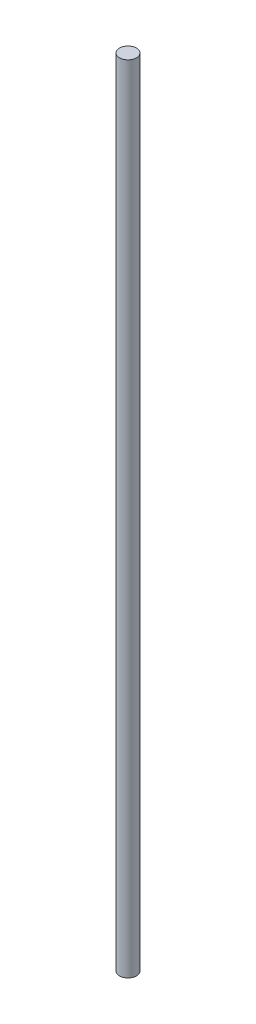
ISO-10303-21;
HEADER;
FILE_DESCRIPTION(('STEP AP214'),'2;1');
FILE_NAME('part.step','',(''),(''),'','','');
FILE_SCHEMA(('AUTOMOTIVE_DESIGN { 1 0 10303 214 1 1 1 1 }'));
ENDSEC;
DATA;
#1=APPLICATION_CONTEXT('core data for automotive mechanical design processes');
#2=APPLICATION_PROTOCOL_DEFINITION('international standard','automotive_design',2000,#1);
#3=PRODUCT_CONTEXT('',#1,'mechanical');
#4=PRODUCT('Part','Part','',(#3));
#5=PRODUCT_RELATED_PRODUCT_CATEGORY('part','',(#4));
#6=PRODUCT_DEFINITION_FORMATION('','',#4);
#7=PRODUCT_DEFINITION_CONTEXT('part definition',#1,'design');
#8=PRODUCT_DEFINITION('design','',#6,#7);
#9=PRODUCT_DEFINITION_SHAPE('','',#8);
#10=(LENGTH_UNIT() NAMED_UNIT(*) SI_UNIT(.MILLI.,.METRE.));
#11=(NAMED_UNIT(*) PLANE_ANGLE_UNIT() SI_UNIT($,.RADIAN.));
#12=(NAMED_UNIT(*) SI_UNIT($,.STERADIAN.) SOLID_ANGLE_UNIT());
#13=UNCERTAINTY_MEASURE_WITH_UNIT(LENGTH_MEASURE(1.E-05),#10,'distance_accuracy_value','');
#14=(GEOMETRIC_REPRESENTATION_CONTEXT(3) GLOBAL_UNCERTAINTY_ASSIGNED_CONTEXT((#13)) GLOBAL_UNIT_ASSIGNED_CONTEXT((#10,
#11,#12)) REPRESENTATION_CONTEXT('',''));
#15=CARTESIAN_POINT('',(0.,0.,0.));
#16=DIRECTION('',(0.,0.,1.));
#17=DIRECTION('',(1.,0.,0.));
#18=AXIS2_PLACEMENT_3D('',#15,#16,#17);
#19=CARTESIAN_POINT('',(0.,375.,0.));
#20=DIRECTION('',(0.,-1.,0.));
#21=DIRECTION('',(0.,0.,-1.));
#22=AXIS2_PLACEMENT_3D('',#19,#20,#21);
#23=CYLINDRICAL_SURFACE('',#22,4.);
#24=CARTESIAN_POINT('',(0.,375.,0.));
#25=DIRECTION('',(0.,1.,0.));
#26=DIRECTION('',(0.,0.,1.));
#27=AXIS2_PLACEMENT_3D('',#24,#25,#26);
#28=CIRCLE('',#27,4.);
#29=CARTESIAN_POINT('',(0.,375.,4.));
#30=VERTEX_POINT('',#29);
#31=EDGE_CURVE('E10',#30,#30,#28,.T.);
#32=ORIENTED_EDGE('',*,*,#31,.F.);
#33=EDGE_LOOP('',(#32));
#34=FACE_BOUND('',#33,.T.);
#35=CARTESIAN_POINT('',(0.,0.,0.));
#36=DIRECTION('',(0.,1.,0.));
#37=DIRECTION('',(0.,0.,1.));
#38=AXIS2_PLACEMENT_3D('',#35,#36,#37);
#39=CIRCLE('',#38,4.);
#40=CARTESIAN_POINT('',(0.,0.,4.));
#41=VERTEX_POINT('',#40);
#42=EDGE_CURVE('E34',#41,#41,#39,.T.);
#43=ORIENTED_EDGE('',*,*,#42,.T.);
#44=EDGE_LOOP('',(#43));
#45=FACE_BOUND('',#44,.T.);
#46=ADVANCED_FACE('F31',(#34,#45),#23,.T.);
#47=CARTESIAN_POINT('',(0.,375.,0.));
#48=DIRECTION('',(0.,1.,0.));
#49=DIRECTION('',(0.,0.,1.));
#50=AXIS2_PLACEMENT_3D('',#47,#48,#49);
#51=PLANE('',#50);
#52=ORIENTED_EDGE('',*,*,#31,.T.);
#53=EDGE_LOOP('',(#52));
#54=FACE_BOUND('',#53,.T.);
#55=ADVANCED_FACE('F46',(#54),#51,.T.);
#56=CARTESIAN_POINT('',(0.,0.,0.));
#57=DIRECTION('',(0.,1.,0.));
#58=DIRECTION('',(0.,0.,1.));
#59=AXIS2_PLACEMENT_3D('',#56,#57,#58);
#60=PLANE('',#59);
#61=ORIENTED_EDGE('',*,*,#42,.F.);
#62=EDGE_LOOP('',(#61));
#63=FACE_BOUND('',#62,.T.);
#64=ADVANCED_FACE('F44',(#63),#60,.F.);
#65=CLOSED_SHELL('',(#46,#55,#64));
#66=MANIFOLD_SOLID_BREP('B2',#65);
#67=ADVANCED_BREP_SHAPE_REPRESENTATION('',(#18,#66),#14);
#68=SHAPE_DEFINITION_REPRESENTATION(#9,#67);
ENDSEC;
END-ISO-10303-21;
